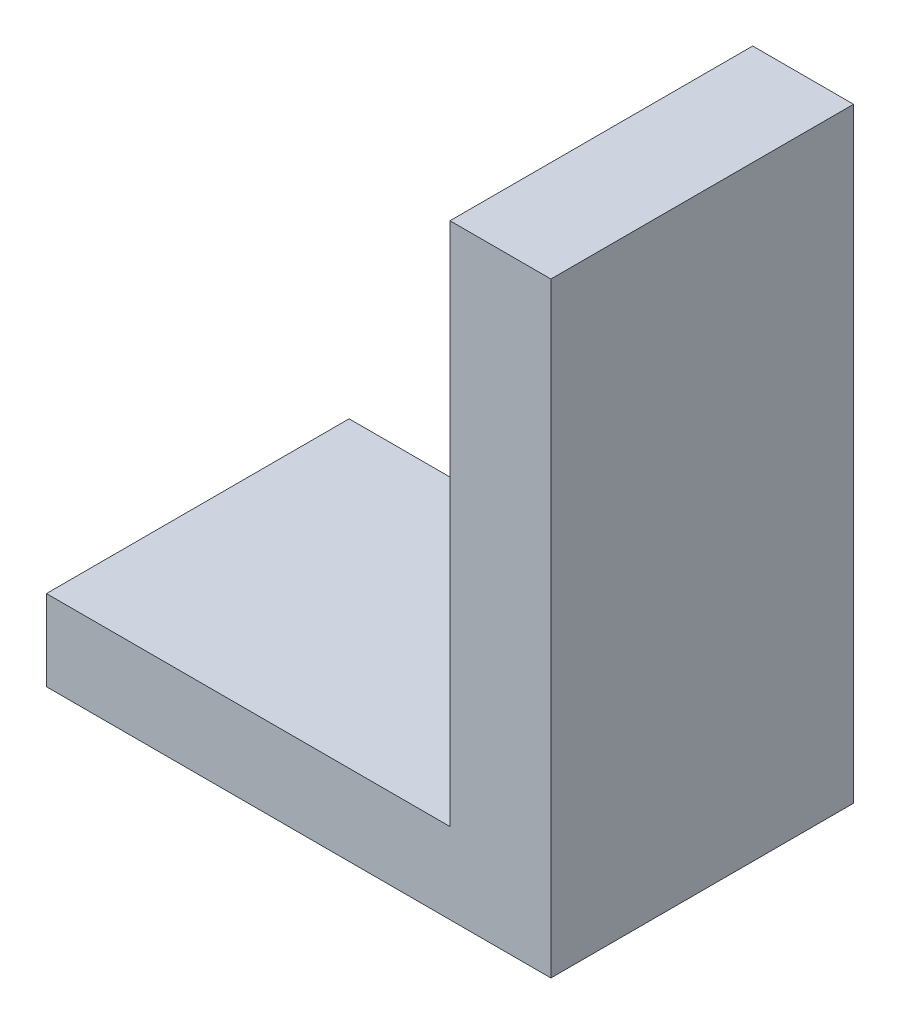
ISO-10303-21;
HEADER;
FILE_DESCRIPTION(('STEP AP214'),'2;1');
FILE_NAME('part.step','',(''),(''),'','','');
FILE_SCHEMA(('AUTOMOTIVE_DESIGN { 1 0 10303 214 1 1 1 1 }'));
ENDSEC;
DATA;
#1=APPLICATION_CONTEXT('core data for automotive mechanical design processes');
#2=APPLICATION_PROTOCOL_DEFINITION('international standard','automotive_design',2000,#1);
#3=PRODUCT_CONTEXT('',#1,'mechanical');
#4=PRODUCT('Part','Part','',(#3));
#5=PRODUCT_RELATED_PRODUCT_CATEGORY('part','',(#4));
#6=PRODUCT_DEFINITION_FORMATION('','',#4);
#7=PRODUCT_DEFINITION_CONTEXT('part definition',#1,'design');
#8=PRODUCT_DEFINITION('design','',#6,#7);
#9=PRODUCT_DEFINITION_SHAPE('','',#8);
#10=(LENGTH_UNIT() NAMED_UNIT(*) SI_UNIT(.MILLI.,.METRE.));
#11=(NAMED_UNIT(*) PLANE_ANGLE_UNIT() SI_UNIT($,.RADIAN.));
#12=(NAMED_UNIT(*) SI_UNIT($,.STERADIAN.) SOLID_ANGLE_UNIT());
#13=UNCERTAINTY_MEASURE_WITH_UNIT(LENGTH_MEASURE(1.E-05),#10,'distance_accuracy_value','');
#14=(GEOMETRIC_REPRESENTATION_CONTEXT(3) GLOBAL_UNCERTAINTY_ASSIGNED_CONTEXT((#13)) GLOBAL_UNIT_ASSIGNED_CONTEXT((#10,
#11,#12)) REPRESENTATION_CONTEXT('',''));
#15=CARTESIAN_POINT('',(0.,0.,0.));
#16=DIRECTION('',(0.,0.,1.));
#17=DIRECTION('',(1.,0.,0.));
#18=AXIS2_PLACEMENT_3D('',#15,#16,#17);
#19=CARTESIAN_POINT('',(-62.5,20.,37.5));
#20=DIRECTION('',(1.,0.,0.));
#21=DIRECTION('',(0.,0.,-1.));
#22=AXIS2_PLACEMENT_3D('',#19,#20,#21);
#23=PLANE('',#22);
#24=DIRECTION('',(0.,-1.,0.));
#25=VECTOR('',#24,1.);
#26=CARTESIAN_POINT('',(-62.5,20.,-37.5));
#27=LINE('',#26,#25);
#28=CARTESIAN_POINT('',(-62.5,20.,-37.5));
#29=VERTEX_POINT('',#28);
#30=CARTESIAN_POINT('',(-62.5,0.,-37.5));
#31=VERTEX_POINT('',#30);
#32=EDGE_CURVE('E123',#29,#31,#27,.T.);
#33=ORIENTED_EDGE('',*,*,#32,.T.);
#34=DIRECTION('',(0.,0.,-1.));
#35=VECTOR('',#34,1.);
#36=CARTESIAN_POINT('',(-62.5,0.,37.5));
#37=LINE('',#36,#35);
#38=CARTESIAN_POINT('',(-62.5,0.,37.5));
#39=VERTEX_POINT('',#38);
#40=EDGE_CURVE('E11',#39,#31,#37,.T.);
#41=ORIENTED_EDGE('',*,*,#40,.F.);
#42=DIRECTION('',(0.,-1.,0.));
#43=VECTOR('',#42,1.);
#44=CARTESIAN_POINT('',(-62.5,20.,37.5));
#45=LINE('',#44,#43);
#46=CARTESIAN_POINT('',(-62.5,20.,37.5));
#47=VERTEX_POINT('',#46);
#48=EDGE_CURVE('E134',#47,#39,#45,.T.);
#49=ORIENTED_EDGE('',*,*,#48,.F.);
#50=DIRECTION('',(0.,0.,-1.));
#51=VECTOR('',#50,1.);
#52=CARTESIAN_POINT('',(-62.5,20.,37.5));
#53=LINE('',#52,#51);
#54=EDGE_CURVE('E119',#47,#29,#53,.T.);
#55=ORIENTED_EDGE('',*,*,#54,.T.);
#56=EDGE_LOOP('',(#33,#41,#49,#55));
#57=FACE_BOUND('',#56,.T.);
#58=ADVANCED_FACE('F39',(#57),#23,.F.);
#59=CARTESIAN_POINT('',(-62.5,0.,37.5));
#60=DIRECTION('',(0.,1.,0.));
#61=DIRECTION('',(0.,0.,1.));
#62=AXIS2_PLACEMENT_3D('',#59,#60,#61);
#63=PLANE('',#62);
#64=CARTESIAN_POINT('',(-50.,0.,0.));
#65=DIRECTION('',(0.,1.,0.));
#66=DIRECTION('',(0.,0.,1.));
#67=AXIS2_PLACEMENT_3D('',#64,#65,#66);
#68=CIRCLE('',#67,5.);
#69=CARTESIAN_POINT('',(-50.,0.,5.));
#70=VERTEX_POINT('',#69);
#71=EDGE_CURVE('E243',#70,#70,#68,.T.);
#72=ORIENTED_EDGE('',*,*,#71,.T.);
#73=EDGE_LOOP('',(#72));
#74=FACE_BOUND('',#73,.T.);
#75=CARTESIAN_POINT('',(0.,0.,0.));
#76=DIRECTION('',(0.,1.,0.));
#77=DIRECTION('',(0.,0.,1.));
#78=AXIS2_PLACEMENT_3D('',#75,#76,#77);
#79=CIRCLE('',#78,5.);
#80=CARTESIAN_POINT('',(0.,0.,5.));
#81=VERTEX_POINT('',#80);
#82=EDGE_CURVE('E245',#81,#81,#79,.T.);
#83=ORIENTED_EDGE('',*,*,#82,.T.);
#84=EDGE_LOOP('',(#83));
#85=FACE_BOUND('',#84,.T.);
#86=DIRECTION('',(1.,0.,0.));
#87=VECTOR('',#86,1.);
#88=CARTESIAN_POINT('',(-62.5,0.,-37.5));
#89=LINE('',#88,#87);
#90=CARTESIAN_POINT('',(62.5,0.,-37.5));
#91=VERTEX_POINT('',#90);
#92=EDGE_CURVE('E126',#31,#91,#89,.T.);
#93=ORIENTED_EDGE('',*,*,#92,.T.);
#94=DIRECTION('',(0.,0.,-1.));
#95=VECTOR('',#94,1.);
#96=CARTESIAN_POINT('',(62.5,0.,37.5));
#97=LINE('',#96,#95);
#98=CARTESIAN_POINT('',(62.5,0.,37.5));
#99=VERTEX_POINT('',#98);
#100=EDGE_CURVE('E47',#99,#91,#97,.T.);
#101=ORIENTED_EDGE('',*,*,#100,.F.);
#102=DIRECTION('',(1.,0.,0.));
#103=VECTOR('',#102,1.);
#104=CARTESIAN_POINT('',(-62.5,0.,37.5));
#105=LINE('',#104,#103);
#106=EDGE_CURVE('E92',#39,#99,#105,.T.);
#107=ORIENTED_EDGE('',*,*,#106,.F.);
#108=ORIENTED_EDGE('',*,*,#40,.T.);
#109=EDGE_LOOP('',(#93,#101,#107,#108));
#110=FACE_BOUND('',#109,.T.);
#111=ADVANCED_FACE('F158',(#74,#85,#110),#63,.F.);
#112=CARTESIAN_POINT('',(62.5,0.,37.5));
#113=DIRECTION('',(-1.,0.,0.));
#114=DIRECTION('',(0.,0.,1.));
#115=AXIS2_PLACEMENT_3D('',#112,#113,#114);
#116=PLANE('',#115);
#117=DIRECTION('',(0.,1.,0.));
#118=VECTOR('',#117,1.);
#119=CARTESIAN_POINT('',(62.5,0.,-37.5));
#120=LINE('',#119,#118);
#121=CARTESIAN_POINT('',(62.5,150.,-37.5));
#122=VERTEX_POINT('',#121);
#123=EDGE_CURVE('E129',#91,#122,#120,.T.);
#124=ORIENTED_EDGE('',*,*,#123,.T.);
#125=DIRECTION('',(0.,0.,-1.));
#126=VECTOR('',#125,1.);
#127=CARTESIAN_POINT('',(62.5,150.,37.5));
#128=LINE('',#127,#126);
#129=CARTESIAN_POINT('',(62.5,150.,37.5));
#130=VERTEX_POINT('',#129);
#131=EDGE_CURVE('E114',#130,#122,#128,.T.);
#132=ORIENTED_EDGE('',*,*,#131,.F.);
#133=DIRECTION('',(0.,1.,0.));
#134=VECTOR('',#133,1.);
#135=CARTESIAN_POINT('',(62.5,0.,37.5));
#136=LINE('',#135,#134);
#137=EDGE_CURVE('E105',#99,#130,#136,.T.);
#138=ORIENTED_EDGE('',*,*,#137,.F.);
#139=ORIENTED_EDGE('',*,*,#100,.T.);
#140=EDGE_LOOP('',(#124,#132,#138,#139));
#141=FACE_BOUND('',#140,.T.);
#142=ADVANCED_FACE('F140',(#141),#116,.F.);
#143=CARTESIAN_POINT('',(62.5,150.,37.5));
#144=DIRECTION('',(0.,-1.,0.));
#145=DIRECTION('',(0.,0.,-1.));
#146=AXIS2_PLACEMENT_3D('',#143,#144,#145);
#147=PLANE('',#146);
#148=DIRECTION('',(-1.,0.,0.));
#149=VECTOR('',#148,1.);
#150=CARTESIAN_POINT('',(62.5,150.,-37.5));
#151=LINE('',#150,#149);
#152=CARTESIAN_POINT('',(37.5,150.,-37.5));
#153=VERTEX_POINT('',#152);
#154=EDGE_CURVE('E113',#122,#153,#151,.T.);
#155=ORIENTED_EDGE('',*,*,#154,.T.);
#156=DIRECTION('',(0.,0.,-1.));
#157=VECTOR('',#156,1.);
#158=CARTESIAN_POINT('',(37.5,150.,37.5));
#159=LINE('',#158,#157);
#160=CARTESIAN_POINT('',(37.5,150.,37.5));
#161=VERTEX_POINT('',#160);
#162=EDGE_CURVE('E110',#161,#153,#159,.T.);
#163=ORIENTED_EDGE('',*,*,#162,.F.);
#164=DIRECTION('',(-1.,0.,0.));
#165=VECTOR('',#164,1.);
#166=CARTESIAN_POINT('',(62.5,150.,37.5));
#167=LINE('',#166,#165);
#168=EDGE_CURVE('E99',#130,#161,#167,.T.);
#169=ORIENTED_EDGE('',*,*,#168,.F.);
#170=ORIENTED_EDGE('',*,*,#131,.T.);
#171=EDGE_LOOP('',(#155,#163,#169,#170));
#172=FACE_BOUND('',#171,.T.);
#173=ADVANCED_FACE('F111',(#172),#147,.F.);
#174=CARTESIAN_POINT('',(37.5,150.,37.5));
#175=DIRECTION('',(1.,0.,0.));
#176=DIRECTION('',(0.,0.,-1.));
#177=AXIS2_PLACEMENT_3D('',#174,#175,#176);
#178=PLANE('',#177);
#179=DIRECTION('',(0.,-1.,0.));
#180=VECTOR('',#179,1.);
#181=CARTESIAN_POINT('',(37.5,150.,-37.5));
#182=LINE('',#181,#180);
#183=CARTESIAN_POINT('',(37.5,20.,-37.5));
#184=VERTEX_POINT('',#183);
#185=EDGE_CURVE('E78',#153,#184,#182,.T.);
#186=ORIENTED_EDGE('',*,*,#185,.T.);
#187=DIRECTION('',(0.,0.,-1.));
#188=VECTOR('',#187,1.);
#189=CARTESIAN_POINT('',(37.5,20.,37.5));
#190=LINE('',#189,#188);
#191=CARTESIAN_POINT('',(37.5,20.,37.5));
#192=VERTEX_POINT('',#191);
#193=EDGE_CURVE('E115',#192,#184,#190,.T.);
#194=ORIENTED_EDGE('',*,*,#193,.F.);
#195=DIRECTION('',(0.,-1.,0.));
#196=VECTOR('',#195,1.);
#197=CARTESIAN_POINT('',(37.5,150.,37.5));
#198=LINE('',#197,#196);
#199=EDGE_CURVE('E103',#161,#192,#198,.T.);
#200=ORIENTED_EDGE('',*,*,#199,.F.);
#201=ORIENTED_EDGE('',*,*,#162,.T.);
#202=EDGE_LOOP('',(#186,#194,#200,#201));
#203=FACE_BOUND('',#202,.T.);
#204=ADVANCED_FACE('F117',(#203),#178,.F.);
#205=CARTESIAN_POINT('',(37.5,20.,37.5));
#206=DIRECTION('',(0.,-1.,0.));
#207=DIRECTION('',(0.,0.,-1.));
#208=AXIS2_PLACEMENT_3D('',#205,#206,#207);
#209=PLANE('',#208);
#210=DIRECTION('',(-1.,0.,0.));
#211=VECTOR('',#210,1.);
#212=CARTESIAN_POINT('',(37.5,20.,-37.5));
#213=LINE('',#212,#211);
#214=EDGE_CURVE('E84',#184,#29,#213,.T.);
#215=ORIENTED_EDGE('',*,*,#214,.T.);
#216=ORIENTED_EDGE('',*,*,#54,.F.);
#217=DIRECTION('',(-1.,0.,0.));
#218=VECTOR('',#217,1.);
#219=CARTESIAN_POINT('',(37.5,20.,37.5));
#220=LINE('',#219,#218);
#221=EDGE_CURVE('E55',#192,#47,#220,.T.);
#222=ORIENTED_EDGE('',*,*,#221,.F.);
#223=ORIENTED_EDGE('',*,*,#193,.T.);
#224=EDGE_LOOP('',(#215,#216,#222,#223));
#225=FACE_BOUND('',#224,.T.);
#226=ADVANCED_FACE('F147',(#225),#209,.F.);
#227=CARTESIAN_POINT('',(0.,0.,37.5));
#228=DIRECTION('',(0.,0.,1.));
#229=DIRECTION('',(1.,0.,0.));
#230=AXIS2_PLACEMENT_3D('',#227,#228,#229);
#231=PLANE('',#230);
#232=ORIENTED_EDGE('',*,*,#48,.T.);
#233=ORIENTED_EDGE('',*,*,#106,.T.);
#234=ORIENTED_EDGE('',*,*,#137,.T.);
#235=ORIENTED_EDGE('',*,*,#168,.T.);
#236=ORIENTED_EDGE('',*,*,#199,.T.);
#237=ORIENTED_EDGE('',*,*,#221,.T.);
#238=EDGE_LOOP('',(#232,#233,#234,#235,#236,#237));
#239=FACE_BOUND('',#238,.T.);
#240=ADVANCED_FACE('F101',(#239),#231,.T.);
#241=CARTESIAN_POINT('',(0.,0.,-37.5));
#242=DIRECTION('',(0.,0.,1.));
#243=DIRECTION('',(1.,0.,0.));
#244=AXIS2_PLACEMENT_3D('',#241,#242,#243);
#245=PLANE('',#244);
#246=ORIENTED_EDGE('',*,*,#32,.F.);
#247=ORIENTED_EDGE('',*,*,#214,.F.);
#248=ORIENTED_EDGE('',*,*,#185,.F.);
#249=ORIENTED_EDGE('',*,*,#154,.F.);
#250=ORIENTED_EDGE('',*,*,#123,.F.);
#251=ORIENTED_EDGE('',*,*,#92,.F.);
#252=EDGE_LOOP('',(#246,#247,#248,#249,#250,#251));
#253=FACE_BOUND('',#252,.T.);
#254=ADVANCED_FACE('F143',(#253),#245,.F.);
#255=CARTESIAN_POINT('',(0.,14.,0.));
#256=DIRECTION('',(0.,-1.,0.));
#257=DIRECTION('',(0.,0.,-1.));
#258=AXIS2_PLACEMENT_3D('',#255,#256,#257);
#259=CYLINDRICAL_SURFACE('',#258,5.);
#260=CARTESIAN_POINT('',(0.,14.,0.));
#261=DIRECTION('',(0.,1.,0.));
#262=DIRECTION('',(0.,0.,1.));
#263=AXIS2_PLACEMENT_3D('',#260,#261,#262);
#264=CIRCLE('',#263,5.);
#265=CARTESIAN_POINT('',(0.,14.,5.));
#266=VERTEX_POINT('',#265);
#267=EDGE_CURVE('E250',#266,#266,#264,.T.);
#268=ORIENTED_EDGE('',*,*,#267,.T.);
#269=EDGE_LOOP('',(#268));
#270=FACE_BOUND('',#269,.T.);
#271=ORIENTED_EDGE('',*,*,#82,.F.);
#272=EDGE_LOOP('',(#271));
#273=FACE_BOUND('',#272,.T.);
#274=ADVANCED_FACE('F201',(#270,#273),#259,.F.);
#275=CARTESIAN_POINT('',(0.,14.,0.));
#276=DIRECTION('',(0.,1.,0.));
#277=DIRECTION('',(0.,0.,1.));
#278=AXIS2_PLACEMENT_3D('',#275,#276,#277);
#279=PLANE('',#278);
#280=ORIENTED_EDGE('',*,*,#267,.F.);
#281=EDGE_LOOP('',(#280));
#282=FACE_BOUND('',#281,.T.);
#283=ADVANCED_FACE('F208',(#282),#279,.F.);
#284=CARTESIAN_POINT('',(-50.,14.,0.));
#285=DIRECTION('',(0.,-1.,0.));
#286=DIRECTION('',(0.,0.,-1.));
#287=AXIS2_PLACEMENT_3D('',#284,#285,#286);
#288=CYLINDRICAL_SURFACE('',#287,5.);
#289=CARTESIAN_POINT('',(-50.,14.,0.));
#290=DIRECTION('',(0.,1.,0.));
#291=DIRECTION('',(0.,0.,1.));
#292=AXIS2_PLACEMENT_3D('',#289,#290,#291);
#293=CIRCLE('',#292,5.);
#294=CARTESIAN_POINT('',(-50.,14.,5.));
#295=VERTEX_POINT('',#294);
#296=EDGE_CURVE('E127',#295,#295,#293,.T.);
#297=ORIENTED_EDGE('',*,*,#296,.T.);
#298=EDGE_LOOP('',(#297));
#299=FACE_BOUND('',#298,.T.);
#300=ORIENTED_EDGE('',*,*,#71,.F.);
#301=EDGE_LOOP('',(#300));
#302=FACE_BOUND('',#301,.T.);
#303=ADVANCED_FACE('F218',(#299,#302),#288,.F.);
#304=CARTESIAN_POINT('',(-50.,14.,0.));
#305=DIRECTION('',(0.,1.,0.));
#306=DIRECTION('',(0.,0.,1.));
#307=AXIS2_PLACEMENT_3D('',#304,#305,#306);
#308=PLANE('',#307);
#309=ORIENTED_EDGE('',*,*,#296,.F.);
#310=EDGE_LOOP('',(#309));
#311=FACE_BOUND('',#310,.T.);
#312=ADVANCED_FACE('F228',(#311),#308,.F.);
#313=CLOSED_SHELL('',(#58,#111,#142,#173,#204,#226,#240,#254,#274,#283,#303,#312));
#314=MANIFOLD_SOLID_BREP('B2',#313);
#315=ADVANCED_BREP_SHAPE_REPRESENTATION('',(#18,#314),#14);
#316=SHAPE_DEFINITION_REPRESENTATION(#9,#315);
ENDSEC;
END-ISO-10303-21;
